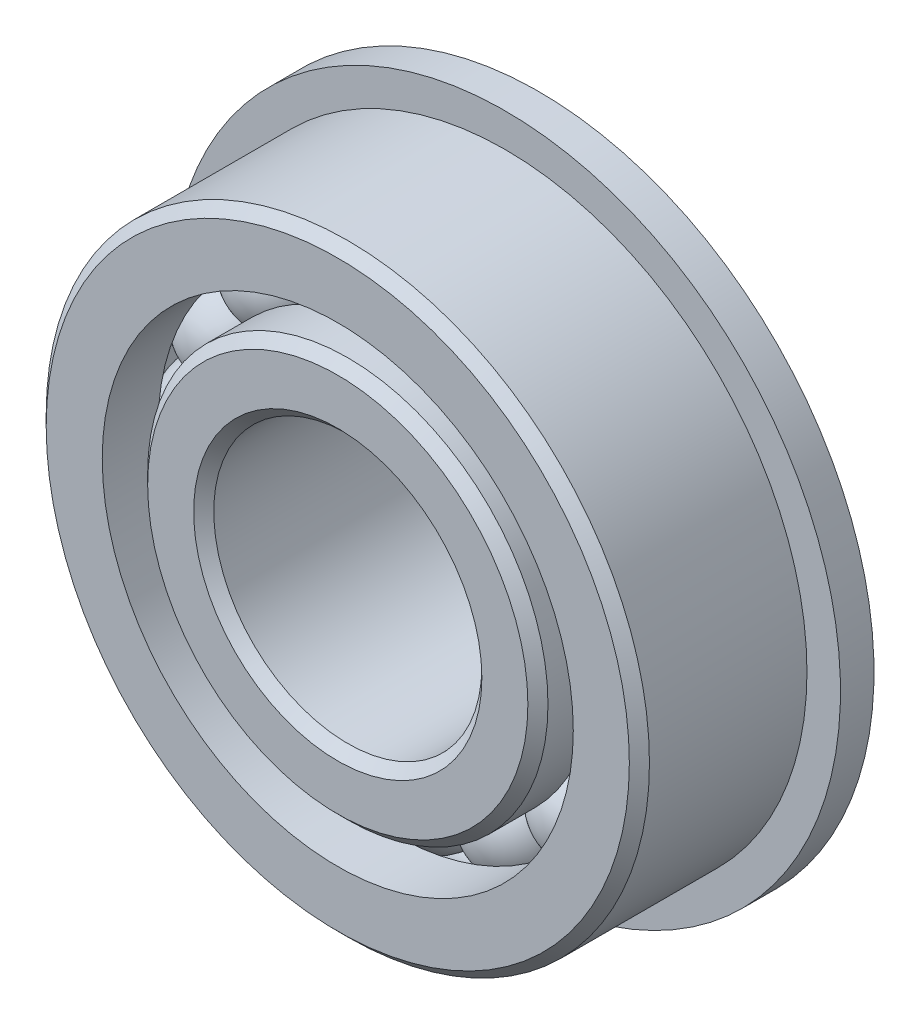
ISO-10303-21;
HEADER;
FILE_DESCRIPTION(('STEP AP214'),'2;1');
FILE_NAME('part.step','',(''),(''),'','','');
FILE_SCHEMA(('AUTOMOTIVE_DESIGN { 1 0 10303 214 1 1 1 1 }'));
ENDSEC;
DATA;
#1=APPLICATION_CONTEXT('core data for automotive mechanical design processes');
#2=APPLICATION_PROTOCOL_DEFINITION('international standard','automotive_design',2000,#1);
#3=PRODUCT_CONTEXT('',#1,'mechanical');
#4=PRODUCT('Part','Part','',(#3));
#5=PRODUCT_RELATED_PRODUCT_CATEGORY('part','',(#4));
#6=PRODUCT_DEFINITION_FORMATION('','',#4);
#7=PRODUCT_DEFINITION_CONTEXT('part definition',#1,'design');
#8=PRODUCT_DEFINITION('design','',#6,#7);
#9=PRODUCT_DEFINITION_SHAPE('','',#8);
#10=(LENGTH_UNIT() NAMED_UNIT(*) SI_UNIT(.MILLI.,.METRE.));
#11=(NAMED_UNIT(*) PLANE_ANGLE_UNIT() SI_UNIT($,.RADIAN.));
#12=(NAMED_UNIT(*) SI_UNIT($,.STERADIAN.) SOLID_ANGLE_UNIT());
#13=UNCERTAINTY_MEASURE_WITH_UNIT(LENGTH_MEASURE(1.E-05),#10,'distance_accuracy_value','');
#14=(GEOMETRIC_REPRESENTATION_CONTEXT(3) GLOBAL_UNCERTAINTY_ASSIGNED_CONTEXT((#13)) GLOBAL_UNIT_ASSIGNED_CONTEXT((#10,
#11,#12)) REPRESENTATION_CONTEXT('',''));
#15=CARTESIAN_POINT('',(0.,0.,0.));
#16=DIRECTION('',(0.,0.,1.));
#17=DIRECTION('',(1.,0.,0.));
#18=AXIS2_PLACEMENT_3D('',#15,#16,#17);
#19=CARTESIAN_POINT('',(-3.94881466771714,9.53328192610089,0.));
#20=DIRECTION('',(0.,0.,1.));
#21=DIRECTION('',(-0.382683432365077,0.923879532511292,0.));
#22=AXIS2_PLACEMENT_3D('',#19,#20,#21);
#23=SPHERICAL_SURFACE('',#22,2.27628073054021);
#24=CARTESIAN_POINT('',(-3.94881466771714,9.53328192610089,2.27628073054021));
#25=VERTEX_POINT('',#24);
#26=VERTEX_LOOP('',#25);
#27=FACE_BOUND('',#26,.T.);
#28=ADVANCED_FACE('F37',(#27),#23,.T.);
#29=CLOSED_SHELL('',(#28));
#30=MANIFOLD_SOLID_BREP('B2',#29);
#31=CARTESIAN_POINT('',(-7.2964580983686,7.29645809836878,0.));
#32=DIRECTION('',(0.,0.,1.));
#33=DIRECTION('',(-0.707106781186539,0.707106781186556,0.));
#34=AXIS2_PLACEMENT_3D('',#31,#32,#33);
#35=SPHERICAL_SURFACE('',#34,2.27628073054021);
#36=CARTESIAN_POINT('',(-7.2964580983686,7.29645809836878,2.27628073054021));
#37=VERTEX_POINT('',#36);
#38=VERTEX_LOOP('',#37);
#39=FACE_BOUND('',#38,.T.);
#40=ADVANCED_FACE('F57',(#39),#35,.T.);
#41=CLOSED_SHELL('',(#40));
#42=MANIFOLD_SOLID_BREP('B6',#41);
#43=CARTESIAN_POINT('',(-9.5332819261008,3.94881466771737,0.));
#44=DIRECTION('',(0.,0.,1.));
#45=DIRECTION('',(-0.923879532511283,0.3826834323651,0.));
#46=AXIS2_PLACEMENT_3D('',#43,#44,#45);
#47=SPHERICAL_SURFACE('',#46,2.27628073054021);
#48=CARTESIAN_POINT('',(-9.5332819261008,3.94881466771737,2.27628073054021));
#49=VERTEX_POINT('',#48);
#50=VERTEX_LOOP('',#49);
#51=FACE_BOUND('',#50,.T.);
#52=ADVANCED_FACE('F77',(#51),#47,.T.);
#53=CLOSED_SHELL('',(#52));
#54=MANIFOLD_SOLID_BREP('B33',#53);
#55=CARTESIAN_POINT('',(-10.31875,1.08083169195563E-13,0.));
#56=DIRECTION('',(0.,0.,1.));
#57=DIRECTION('',(-1.,0.,0.));
#58=AXIS2_PLACEMENT_3D('',#55,#56,#57);
#59=SPHERICAL_SURFACE('',#58,2.27628073054021);
#60=CARTESIAN_POINT('',(-10.31875,1.08083169195563E-13,2.27628073054021));
#61=VERTEX_POINT('',#60);
#62=VERTEX_LOOP('',#61);
#63=FACE_BOUND('',#62,.T.);
#64=ADVANCED_FACE('F97',(#63),#59,.T.);
#65=CLOSED_SHELL('',(#64));
#66=MANIFOLD_SOLID_BREP('B53',#65);
#67=CARTESIAN_POINT('',(-9.53328192610088,-3.94881466771717,0.));
#68=DIRECTION('',(0.,0.,1.));
#69=DIRECTION('',(-0.923879532511291,-0.382683432365081,0.));
#70=AXIS2_PLACEMENT_3D('',#67,#68,#69);
#71=SPHERICAL_SURFACE('',#70,2.27628073054021);
#72=CARTESIAN_POINT('',(-9.53328192610088,-3.94881466771717,2.27628073054021));
#73=VERTEX_POINT('',#72);
#74=VERTEX_LOOP('',#73);
#75=FACE_BOUND('',#74,.T.);
#76=ADVANCED_FACE('F117',(#75),#71,.T.);
#77=CLOSED_SHELL('',(#76));
#78=MANIFOLD_SOLID_BREP('B73',#77);
#79=CARTESIAN_POINT('',(-7.29645809836875,-7.29645809836862,0.));
#80=DIRECTION('',(0.,0.,1.));
#81=DIRECTION('',(-0.707106781186554,-0.707106781186541,0.));
#82=AXIS2_PLACEMENT_3D('',#79,#80,#81);
#83=SPHERICAL_SURFACE('',#82,2.27628073054021);
#84=CARTESIAN_POINT('',(-7.29645809836875,-7.29645809836862,2.27628073054021));
#85=VERTEX_POINT('',#84);
#86=VERTEX_LOOP('',#85);
#87=FACE_BOUND('',#86,.T.);
#88=ADVANCED_FACE('F137',(#87),#83,.T.);
#89=CLOSED_SHELL('',(#88));
#90=MANIFOLD_SOLID_BREP('B93',#89);
#91=CARTESIAN_POINT('',(-3.94881466771735,-9.53328192610081,0.));
#92=DIRECTION('',(0.,0.,1.));
#93=DIRECTION('',(-0.382683432365097,-0.923879532511284,0.));
#94=AXIS2_PLACEMENT_3D('',#91,#92,#93);
#95=SPHERICAL_SURFACE('',#94,2.27628073054021);
#96=CARTESIAN_POINT('',(-3.94881466771735,-9.53328192610081,2.27628073054021));
#97=VERTEX_POINT('',#96);
#98=VERTEX_LOOP('',#97);
#99=FACE_BOUND('',#98,.T.);
#100=ADVANCED_FACE('F157',(#99),#95,.T.);
#101=CLOSED_SHELL('',(#100));
#102=MANIFOLD_SOLID_BREP('B113',#101);
#103=CARTESIAN_POINT('',(0.,-10.31875,0.));
#104=DIRECTION('',(0.,0.,1.));
#105=DIRECTION('',(0.,-1.,0.));
#106=AXIS2_PLACEMENT_3D('',#103,#104,#105);
#107=SPHERICAL_SURFACE('',#106,2.27628073054021);
#108=CARTESIAN_POINT('',(0.,-10.31875,2.27628073054021));
#109=VERTEX_POINT('',#108);
#110=VERTEX_LOOP('',#109);
#111=FACE_BOUND('',#110,.T.);
#112=ADVANCED_FACE('F177',(#111),#107,.T.);
#113=CLOSED_SHELL('',(#112));
#114=MANIFOLD_SOLID_BREP('B133',#113);
#115=CARTESIAN_POINT('',(3.94881466771721,-9.53328192610086,0.));
#116=DIRECTION('',(0.,0.,1.));
#117=DIRECTION('',(0.382683432365084,-0.923879532511289,0.));
#118=AXIS2_PLACEMENT_3D('',#115,#116,#117);
#119=SPHERICAL_SURFACE('',#118,2.27628073054021);
#120=CARTESIAN_POINT('',(3.94881466771721,-9.53328192610086,2.27628073054021));
#121=VERTEX_POINT('',#120);
#122=VERTEX_LOOP('',#121);
#123=FACE_BOUND('',#122,.T.);
#124=ADVANCED_FACE('F197',(#123),#119,.T.);
#125=CLOSED_SHELL('',(#124));
#126=MANIFOLD_SOLID_BREP('B153',#125);
#127=CARTESIAN_POINT('',(7.29645809836865,-7.29645809836873,0.));
#128=DIRECTION('',(0.,0.,1.));
#129=DIRECTION('',(0.707106781186544,-0.707106781186551,0.));
#130=AXIS2_PLACEMENT_3D('',#127,#128,#129);
#131=SPHERICAL_SURFACE('',#130,2.27628073054021);
#132=CARTESIAN_POINT('',(7.29645809836865,-7.29645809836873,2.27628073054021));
#133=VERTEX_POINT('',#132);
#134=VERTEX_LOOP('',#133);
#135=FACE_BOUND('',#134,.T.);
#136=ADVANCED_FACE('F217',(#135),#131,.T.);
#137=CLOSED_SHELL('',(#136));
#138=MANIFOLD_SOLID_BREP('B173',#137);
#139=CARTESIAN_POINT('',(9.53328192610082,-3.94881466771731,0.));
#140=DIRECTION('',(0.,0.,1.));
#141=DIRECTION('',(0.923879532511285,-0.382683432365094,0.));
#142=AXIS2_PLACEMENT_3D('',#139,#140,#141);
#143=SPHERICAL_SURFACE('',#142,2.27628073054021);
#144=CARTESIAN_POINT('',(9.53328192610082,-3.94881466771731,2.27628073054021));
#145=VERTEX_POINT('',#144);
#146=VERTEX_LOOP('',#145);
#147=FACE_BOUND('',#146,.T.);
#148=ADVANCED_FACE('F237',(#147),#143,.T.);
#149=CLOSED_SHELL('',(#148));
#150=MANIFOLD_SOLID_BREP('B193',#149);
#151=CARTESIAN_POINT('',(10.31875,0.,0.));
#152=DIRECTION('',(0.,0.,1.));
#153=DIRECTION('',(1.,0.,0.));
#154=AXIS2_PLACEMENT_3D('',#151,#152,#153);
#155=SPHERICAL_SURFACE('',#154,2.27628073054021);
#156=CARTESIAN_POINT('',(10.31875,0.,2.27628073054021));
#157=VERTEX_POINT('',#156);
#158=VERTEX_LOOP('',#157);
#159=FACE_BOUND('',#158,.T.);
#160=ADVANCED_FACE('F257',(#159),#155,.T.);
#161=CLOSED_SHELL('',(#160));
#162=MANIFOLD_SOLID_BREP('B213',#161);
#163=CARTESIAN_POINT('',(9.53328192610085,3.94881466771724,0.));
#164=DIRECTION('',(0.,0.,1.));
#165=DIRECTION('',(0.923879532511288,0.382683432365087,0.));
#166=AXIS2_PLACEMENT_3D('',#163,#164,#165);
#167=SPHERICAL_SURFACE('',#166,2.27628073054021);
#168=CARTESIAN_POINT('',(9.53328192610085,3.94881466771724,2.27628073054021));
#169=VERTEX_POINT('',#168);
#170=VERTEX_LOOP('',#169);
#171=FACE_BOUND('',#170,.T.);
#172=ADVANCED_FACE('F277',(#171),#167,.T.);
#173=CLOSED_SHELL('',(#172));
#174=MANIFOLD_SOLID_BREP('B233',#173);
#175=CARTESIAN_POINT('',(7.2964580983687,7.29645809836867,0.));
#176=DIRECTION('',(0.,0.,1.));
#177=DIRECTION('',(0.707106781186549,0.707106781186546,0.));
#178=AXIS2_PLACEMENT_3D('',#175,#176,#177);
#179=SPHERICAL_SURFACE('',#178,2.27628073054021);
#180=CARTESIAN_POINT('',(7.2964580983687,7.29645809836867,2.27628073054021));
#181=VERTEX_POINT('',#180);
#182=VERTEX_LOOP('',#181);
#183=FACE_BOUND('',#182,.T.);
#184=ADVANCED_FACE('F297',(#183),#179,.T.);
#185=CLOSED_SHELL('',(#184));
#186=MANIFOLD_SOLID_BREP('B253',#185);
#187=CARTESIAN_POINT('',(3.94881466771728,9.53328192610084,0.));
#188=DIRECTION('',(0.,0.,1.));
#189=DIRECTION('',(0.382683432365091,0.923879532511287,0.));
#190=AXIS2_PLACEMENT_3D('',#187,#188,#189);
#191=SPHERICAL_SURFACE('',#190,2.27628073054021);
#192=CARTESIAN_POINT('',(3.94881466771728,9.53328192610084,2.27628073054021));
#193=VERTEX_POINT('',#192);
#194=VERTEX_LOOP('',#193);
#195=FACE_BOUND('',#194,.T.);
#196=ADVANCED_FACE('F317',(#195),#191,.T.);
#197=CLOSED_SHELL('',(#196));
#198=MANIFOLD_SOLID_BREP('B273',#197);
#199=CARTESIAN_POINT('',(0.,10.31875,0.));
#200=DIRECTION('',(0.,0.,1.));
#201=DIRECTION('',(0.,1.,0.));
#202=AXIS2_PLACEMENT_3D('',#199,#200,#201);
#203=SPHERICAL_SURFACE('',#202,2.27628073054021);
#204=CARTESIAN_POINT('',(0.,10.31875,2.27628073054021));
#205=VERTEX_POINT('',#204);
#206=VERTEX_LOOP('',#205);
#207=FACE_BOUND('',#206,.T.);
#208=ADVANCED_FACE('F339',(#207),#203,.T.);
#209=CLOSED_SHELL('',(#208));
#210=MANIFOLD_SOLID_BREP('B293',#209);
#211=CARTESIAN_POINT('',(0.,0.,4.28625));
#212=DIRECTION('',(0.,0.,-1.));
#213=DIRECTION('',(-1.,0.,0.));
#214=AXIS2_PLACEMENT_3D('',#211,#212,#213);
#215=CONICAL_SURFACE('',#214,9.48138736263737,0.785398163397445);
#216=CARTESIAN_POINT('',(0.,0.,4.7625));
#217=DIRECTION('',(0.,0.,1.));
#218=DIRECTION('',(1.,0.,0.));
#219=AXIS2_PLACEMENT_3D('',#216,#217,#218);
#220=CIRCLE('',#219,9.00513736263737);
#221=CARTESIAN_POINT('',(9.00513736263737,0.,4.7625));
#222=VERTEX_POINT('',#221);
#223=EDGE_CURVE('E392',#222,#222,#220,.T.);
#224=ORIENTED_EDGE('',*,*,#223,.F.);
#225=EDGE_LOOP('',(#224));
#226=FACE_BOUND('',#225,.T.);
#227=CARTESIAN_POINT('',(0.,0.,4.28625));
#228=DIRECTION('',(0.,0.,1.));
#229=DIRECTION('',(1.,0.,0.));
#230=AXIS2_PLACEMENT_3D('',#227,#228,#229);
#231=CIRCLE('',#230,9.48138736263737);
#232=CARTESIAN_POINT('',(9.48138736263737,0.,4.28625));
#233=VERTEX_POINT('',#232);
#234=EDGE_CURVE('E338',#233,#233,#231,.T.);
#235=ORIENTED_EDGE('',*,*,#234,.T.);
#236=EDGE_LOOP('',(#235));
#237=FACE_BOUND('',#236,.T.);
#238=ADVANCED_FACE('F358',(#226,#237),#215,.T.);
#239=CARTESIAN_POINT('',(0.,0.,4.7625));
#240=DIRECTION('',(0.,0.,1.));
#241=DIRECTION('',(1.,0.,0.));
#242=AXIS2_PLACEMENT_3D('',#239,#240,#241);
#243=CYLINDRICAL_SURFACE('',#242,9.48138736263737);
#244=ORIENTED_EDGE('',*,*,#234,.F.);
#245=EDGE_LOOP('',(#244));
#246=FACE_BOUND('',#245,.T.);
#247=CARTESIAN_POINT('',(0.,0.,2.11666666666666));
#248=DIRECTION('',(0.,0.,1.));
#249=DIRECTION('',(1.,0.,0.));
#250=AXIS2_PLACEMENT_3D('',#247,#248,#249);
#251=CIRCLE('',#250,9.48138736263737);
#252=CARTESIAN_POINT('',(9.48138736263737,0.,2.11666666666666));
#253=VERTEX_POINT('',#252);
#254=EDGE_CURVE('E364',#253,#253,#251,.T.);
#255=ORIENTED_EDGE('',*,*,#254,.T.);
#256=EDGE_LOOP('',(#255));
#257=FACE_BOUND('',#256,.T.);
#258=ADVANCED_FACE('F399',(#246,#257),#243,.T.);
#259=CARTESIAN_POINT('',(0.,0.,0.));
#260=DIRECTION('',(0.,0.,1.));
#261=DIRECTION('',(1.,0.,0.));
#262=AXIS2_PLACEMENT_3D('',#259,#260,#261);
#263=TOROIDAL_SURFACE('',#262,10.31875,2.27628073054021);
#264=ORIENTED_EDGE('',*,*,#254,.F.);
#265=EDGE_LOOP('',(#264));
#266=FACE_BOUND('',#265,.T.);
#267=CARTESIAN_POINT('',(0.,0.,-2.11666666666667));
#268=DIRECTION('',(0.,0.,1.));
#269=DIRECTION('',(1.,0.,0.));
#270=AXIS2_PLACEMENT_3D('',#267,#268,#269);
#271=CIRCLE('',#270,9.48138736263737);
#272=CARTESIAN_POINT('',(9.48138736263737,0.,-2.11666666666667));
#273=VERTEX_POINT('',#272);
#274=EDGE_CURVE('E368',#273,#273,#271,.T.);
#275=ORIENTED_EDGE('',*,*,#274,.T.);
#276=EDGE_LOOP('',(#275));
#277=FACE_BOUND('',#276,.T.);
#278=ADVANCED_FACE('F403',(#266,#277),#263,.F.);
#279=CARTESIAN_POINT('',(0.,0.,4.7625));
#280=DIRECTION('',(0.,0.,1.));
#281=DIRECTION('',(1.,0.,0.));
#282=AXIS2_PLACEMENT_3D('',#279,#280,#281);
#283=CYLINDRICAL_SURFACE('',#282,9.48138736263737);
#284=ORIENTED_EDGE('',*,*,#274,.F.);
#285=EDGE_LOOP('',(#284));
#286=FACE_BOUND('',#285,.T.);
#287=CARTESIAN_POINT('',(0.,0.,-5.87374999999999));
#288=DIRECTION('',(0.,0.,1.));
#289=DIRECTION('',(1.,0.,0.));
#290=AXIS2_PLACEMENT_3D('',#287,#288,#289);
#291=CIRCLE('',#290,9.48138736263737);
#292=CARTESIAN_POINT('',(9.48138736263737,0.,-5.87374999999999));
#293=VERTEX_POINT('',#292);
#294=EDGE_CURVE('E372',#293,#293,#291,.T.);
#295=ORIENTED_EDGE('',*,*,#294,.T.);
#296=EDGE_LOOP('',(#295));
#297=FACE_BOUND('',#296,.T.);
#298=ADVANCED_FACE('F408',(#286,#297),#283,.T.);
#299=CARTESIAN_POINT('',(0.,0.,-6.35));
#300=DIRECTION('',(0.,0.,1.));
#301=DIRECTION('',(1.,0.,0.));
#302=AXIS2_PLACEMENT_3D('',#299,#300,#301);
#303=CONICAL_SURFACE('',#302,9.00513736263737,0.785398163397443);
#304=ORIENTED_EDGE('',*,*,#294,.F.);
#305=EDGE_LOOP('',(#304));
#306=FACE_BOUND('',#305,.T.);
#307=CARTESIAN_POINT('',(0.,0.,-6.35));
#308=DIRECTION('',(0.,0.,1.));
#309=DIRECTION('',(1.,0.,0.));
#310=AXIS2_PLACEMENT_3D('',#307,#308,#309);
#311=CIRCLE('',#310,9.00513736263737);
#312=CARTESIAN_POINT('',(9.00513736263737,0.,-6.35));
#313=VERTEX_POINT('',#312);
#314=EDGE_CURVE('E377',#313,#313,#311,.T.);
#315=ORIENTED_EDGE('',*,*,#314,.T.);
#316=EDGE_LOOP('',(#315));
#317=FACE_BOUND('',#316,.T.);
#318=ADVANCED_FACE('F414',(#306,#317),#303,.T.);
#319=CARTESIAN_POINT('',(0.,9.00513736263737,-6.34999999999999));
#320=DIRECTION('',(0.,0.,1.));
#321=DIRECTION('',(1.,0.,0.));
#322=AXIS2_PLACEMENT_3D('',#319,#320,#321);
#323=PLANE('',#322);
#324=ORIENTED_EDGE('',*,*,#314,.F.);
#325=EDGE_LOOP('',(#324));
#326=FACE_BOUND('',#325,.T.);
#327=CARTESIAN_POINT('',(0.,0.,-6.34999999999999));
#328=DIRECTION('',(0.,0.,1.));
#329=DIRECTION('',(1.,0.,0.));
#330=AXIS2_PLACEMENT_3D('',#327,#328,#329);
#331=CIRCLE('',#330,6.82625);
#332=CARTESIAN_POINT('',(6.82625,0.,-6.34999999999999));
#333=VERTEX_POINT('',#332);
#334=EDGE_CURVE('E380',#333,#333,#331,.T.);
#335=ORIENTED_EDGE('',*,*,#334,.T.);
#336=EDGE_LOOP('',(#335));
#337=FACE_BOUND('',#336,.T.);
#338=ADVANCED_FACE('F418',(#326,#337),#323,.F.);
#339=CARTESIAN_POINT('',(0.,0.,-5.87374999999999));
#340=DIRECTION('',(0.,0.,-1.));
#341=DIRECTION('',(-1.,0.,0.));
#342=AXIS2_PLACEMENT_3D('',#339,#340,#341);
#343=CONICAL_SURFACE('',#342,6.35,0.785398163397447);
#344=ORIENTED_EDGE('',*,*,#334,.F.);
#345=EDGE_LOOP('',(#344));
#346=FACE_BOUND('',#345,.T.);
#347=CARTESIAN_POINT('',(0.,0.,-5.87374999999999));
#348=DIRECTION('',(0.,0.,1.));
#349=DIRECTION('',(1.,0.,0.));
#350=AXIS2_PLACEMENT_3D('',#347,#348,#349);
#351=CIRCLE('',#350,6.35);
#352=CARTESIAN_POINT('',(6.35,0.,-5.87374999999999));
#353=VERTEX_POINT('',#352);
#354=EDGE_CURVE('E383',#353,#353,#351,.T.);
#355=ORIENTED_EDGE('',*,*,#354,.T.);
#356=EDGE_LOOP('',(#355));
#357=FACE_BOUND('',#356,.T.);
#358=ADVANCED_FACE('F422',(#346,#357),#343,.F.);
#359=CARTESIAN_POINT('',(0.,0.,4.7625));
#360=DIRECTION('',(0.,0.,1.));
#361=DIRECTION('',(1.,0.,0.));
#362=AXIS2_PLACEMENT_3D('',#359,#360,#361);
#363=CYLINDRICAL_SURFACE('',#362,6.35);
#364=ORIENTED_EDGE('',*,*,#354,.F.);
#365=EDGE_LOOP('',(#364));
#366=FACE_BOUND('',#365,.T.);
#367=CARTESIAN_POINT('',(0.,0.,4.28625000000001));
#368=DIRECTION('',(0.,0.,1.));
#369=DIRECTION('',(1.,0.,0.));
#370=AXIS2_PLACEMENT_3D('',#367,#368,#369);
#371=CIRCLE('',#370,6.35);
#372=CARTESIAN_POINT('',(6.35,0.,4.28625000000001));
#373=VERTEX_POINT('',#372);
#374=EDGE_CURVE('E386',#373,#373,#371,.T.);
#375=ORIENTED_EDGE('',*,*,#374,.T.);
#376=EDGE_LOOP('',(#375));
#377=FACE_BOUND('',#376,.T.);
#378=ADVANCED_FACE('F426',(#366,#377),#363,.F.);
#379=CARTESIAN_POINT('',(0.,0.,4.7625));
#380=DIRECTION('',(0.,0.,1.));
#381=DIRECTION('',(1.,0.,0.));
#382=AXIS2_PLACEMENT_3D('',#379,#380,#381);
#383=CONICAL_SURFACE('',#382,6.82625,0.785398163397451);
#384=ORIENTED_EDGE('',*,*,#374,.F.);
#385=EDGE_LOOP('',(#384));
#386=FACE_BOUND('',#385,.T.);
#387=CARTESIAN_POINT('',(0.,0.,4.7625));
#388=DIRECTION('',(0.,0.,1.));
#389=DIRECTION('',(1.,0.,0.));
#390=AXIS2_PLACEMENT_3D('',#387,#388,#389);
#391=CIRCLE('',#390,6.82625);
#392=CARTESIAN_POINT('',(6.82625,0.,4.7625));
#393=VERTEX_POINT('',#392);
#394=EDGE_CURVE('E389',#393,#393,#391,.T.);
#395=ORIENTED_EDGE('',*,*,#394,.T.);
#396=EDGE_LOOP('',(#395));
#397=FACE_BOUND('',#396,.T.);
#398=ADVANCED_FACE('F430',(#386,#397),#383,.F.);
#399=CARTESIAN_POINT('',(0.,6.82625,4.7625));
#400=DIRECTION('',(0.,0.,-1.));
#401=DIRECTION('',(-1.,0.,0.));
#402=AXIS2_PLACEMENT_3D('',#399,#400,#401);
#403=PLANE('',#402);
#404=ORIENTED_EDGE('',*,*,#394,.F.);
#405=EDGE_LOOP('',(#404));
#406=FACE_BOUND('',#405,.T.);
#407=ORIENTED_EDGE('',*,*,#223,.T.);
#408=EDGE_LOOP('',(#407));
#409=FACE_BOUND('',#408,.T.);
#410=ADVANCED_FACE('F396',(#406,#409),#403,.F.);
#411=CLOSED_SHELL('',(#238,#258,#278,#298,#318,#338,#358,#378,#398,#410));
#412=MANIFOLD_SOLID_BREP('B313',#411);
#413=CARTESIAN_POINT('',(0.,0.,4.28625));
#414=DIRECTION('',(0.,0.,-1.));
#415=DIRECTION('',(-1.,0.,0.));
#416=AXIS2_PLACEMENT_3D('',#413,#414,#415);
#417=CONICAL_SURFACE('',#416,14.2875,0.785398163397445);
#418=CARTESIAN_POINT('',(0.,0.,4.7625));
#419=DIRECTION('',(0.,0.,1.));
#420=DIRECTION('',(1.,0.,0.));
#421=AXIS2_PLACEMENT_3D('',#418,#419,#420);
#422=CIRCLE('',#421,13.81125);
#423=CARTESIAN_POINT('',(13.81125,0.,4.7625));
#424=VERTEX_POINT('',#423);
#425=EDGE_CURVE('E531',#424,#424,#422,.T.);
#426=ORIENTED_EDGE('',*,*,#425,.F.);
#427=EDGE_LOOP('',(#426));
#428=FACE_BOUND('',#427,.T.);
#429=CARTESIAN_POINT('',(0.,0.,4.28625));
#430=DIRECTION('',(0.,0.,1.));
#431=DIRECTION('',(1.,0.,0.));
#432=AXIS2_PLACEMENT_3D('',#429,#430,#431);
#433=CIRCLE('',#432,14.2875);
#434=CARTESIAN_POINT('',(14.2875,0.,4.28625));
#435=VERTEX_POINT('',#434);
#436=EDGE_CURVE('E357',#435,#435,#433,.T.);
#437=ORIENTED_EDGE('',*,*,#436,.T.);
#438=EDGE_LOOP('',(#437));
#439=FACE_BOUND('',#438,.T.);
#440=ADVANCED_FACE('F509',(#428,#439),#417,.T.);
#441=CARTESIAN_POINT('',(0.,0.,4.7625));
#442=DIRECTION('',(0.,0.,1.));
#443=DIRECTION('',(1.,0.,0.));
#444=AXIS2_PLACEMENT_3D('',#441,#442,#443);
#445=CYLINDRICAL_SURFACE('',#444,14.2875);
#446=CARTESIAN_POINT('',(0.,0.,-3.175));
#447=DIRECTION('',(0.,0.,1.));
#448=DIRECTION('',(1.,0.,0.));
#449=AXIS2_PLACEMENT_3D('',#446,#447,#448);
#450=CIRCLE('',#449,14.2875);
#451=CARTESIAN_POINT('',(14.2875,0.,-3.175));
#452=VERTEX_POINT('',#451);
#453=EDGE_CURVE('E534',#452,#452,#450,.T.);
#454=ORIENTED_EDGE('',*,*,#453,.T.);
#455=EDGE_LOOP('',(#454));
#456=FACE_BOUND('',#455,.T.);
#457=ORIENTED_EDGE('',*,*,#436,.F.);
#458=EDGE_LOOP('',(#457));
#459=FACE_BOUND('',#458,.T.);
#460=ADVANCED_FACE('F554',(#456,#459),#445,.T.);
#461=CARTESIAN_POINT('',(0.,13.81125,-4.7625));
#462=DIRECTION('',(0.,0.,1.));
#463=DIRECTION('',(1.,0.,0.));
#464=AXIS2_PLACEMENT_3D('',#461,#462,#463);
#465=PLANE('',#464);
#466=CARTESIAN_POINT('',(0.,0.,-4.7625));
#467=DIRECTION('',(0.,0.,1.));
#468=DIRECTION('',(1.,0.,0.));
#469=AXIS2_PLACEMENT_3D('',#466,#467,#468);
#470=CIRCLE('',#469,11.1561126373626);
#471=CARTESIAN_POINT('',(11.1561126373626,0.,-4.7625));
#472=VERTEX_POINT('',#471);
#473=EDGE_CURVE('E515',#472,#472,#470,.T.);
#474=ORIENTED_EDGE('',*,*,#473,.T.);
#475=EDGE_LOOP('',(#474));
#476=FACE_BOUND('',#475,.T.);
#477=CARTESIAN_POINT('',(0.,0.,-4.7625));
#478=DIRECTION('',(0.,0.,-1.));
#479=DIRECTION('',(-1.,0.,0.));
#480=AXIS2_PLACEMENT_3D('',#477,#478,#479);
#481=CIRCLE('',#480,15.875);
#482=CARTESIAN_POINT('',(-15.875,0.,-4.7625));
#483=VERTEX_POINT('',#482);
#484=EDGE_CURVE('E537',#483,#483,#481,.T.);
#485=ORIENTED_EDGE('',*,*,#484,.T.);
#486=EDGE_LOOP('',(#485));
#487=FACE_BOUND('',#486,.T.);
#488=ADVANCED_FACE('F557',(#476,#487),#465,.F.);
#489=CARTESIAN_POINT('',(0.,0.,4.7625));
#490=DIRECTION('',(0.,0.,1.));
#491=DIRECTION('',(1.,0.,0.));
#492=AXIS2_PLACEMENT_3D('',#489,#490,#491);
#493=CYLINDRICAL_SURFACE('',#492,11.1561126373626);
#494=CARTESIAN_POINT('',(0.,0.,-2.11666666666667));
#495=DIRECTION('',(0.,0.,1.));
#496=DIRECTION('',(1.,0.,0.));
#497=AXIS2_PLACEMENT_3D('',#494,#495,#496);
#498=CIRCLE('',#497,11.1561126373626);
#499=CARTESIAN_POINT('',(11.1561126373626,0.,-2.11666666666667));
#500=VERTEX_POINT('',#499);
#501=EDGE_CURVE('E519',#500,#500,#498,.T.);
#502=ORIENTED_EDGE('',*,*,#501,.T.);
#503=EDGE_LOOP('',(#502));
#504=FACE_BOUND('',#503,.T.);
#505=ORIENTED_EDGE('',*,*,#473,.F.);
#506=EDGE_LOOP('',(#505));
#507=FACE_BOUND('',#506,.T.);
#508=ADVANCED_FACE('F562',(#504,#507),#493,.F.);
#509=CARTESIAN_POINT('',(0.,0.,0.));
#510=DIRECTION('',(0.,0.,1.));
#511=DIRECTION('',(1.,0.,0.));
#512=AXIS2_PLACEMENT_3D('',#509,#510,#511);
#513=TOROIDAL_SURFACE('',#512,10.31875,2.27628073054021);
#514=ORIENTED_EDGE('',*,*,#501,.F.);
#515=EDGE_LOOP('',(#514));
#516=FACE_BOUND('',#515,.T.);
#517=CARTESIAN_POINT('',(0.,0.,2.11666666666667));
#518=DIRECTION('',(0.,0.,1.));
#519=DIRECTION('',(1.,0.,0.));
#520=AXIS2_PLACEMENT_3D('',#517,#518,#519);
#521=CIRCLE('',#520,11.1561126373626);
#522=CARTESIAN_POINT('',(11.1561126373626,0.,2.11666666666667));
#523=VERTEX_POINT('',#522);
#524=EDGE_CURVE('E523',#523,#523,#521,.T.);
#525=ORIENTED_EDGE('',*,*,#524,.T.);
#526=EDGE_LOOP('',(#525));
#527=FACE_BOUND('',#526,.T.);
#528=ADVANCED_FACE('F568',(#516,#527),#513,.F.);
#529=CARTESIAN_POINT('',(0.,0.,4.7625));
#530=DIRECTION('',(0.,0.,1.));
#531=DIRECTION('',(1.,0.,0.));
#532=AXIS2_PLACEMENT_3D('',#529,#530,#531);
#533=CYLINDRICAL_SURFACE('',#532,11.1561126373626);
#534=ORIENTED_EDGE('',*,*,#524,.F.);
#535=EDGE_LOOP('',(#534));
#536=FACE_BOUND('',#535,.T.);
#537=CARTESIAN_POINT('',(0.,0.,4.7625));
#538=DIRECTION('',(0.,0.,1.));
#539=DIRECTION('',(1.,0.,0.));
#540=AXIS2_PLACEMENT_3D('',#537,#538,#539);
#541=CIRCLE('',#540,11.1561126373626);
#542=CARTESIAN_POINT('',(11.1561126373626,0.,4.7625));
#543=VERTEX_POINT('',#542);
#544=EDGE_CURVE('E528',#543,#543,#541,.T.);
#545=ORIENTED_EDGE('',*,*,#544,.T.);
#546=EDGE_LOOP('',(#545));
#547=FACE_BOUND('',#546,.T.);
#548=ADVANCED_FACE('F572',(#536,#547),#533,.F.);
#549=CARTESIAN_POINT('',(0.,13.81125,4.7625));
#550=DIRECTION('',(0.,0.,-1.));
#551=DIRECTION('',(-1.,0.,0.));
#552=AXIS2_PLACEMENT_3D('',#549,#550,#551);
#553=PLANE('',#552);
#554=ORIENTED_EDGE('',*,*,#544,.F.);
#555=EDGE_LOOP('',(#554));
#556=FACE_BOUND('',#555,.T.);
#557=ORIENTED_EDGE('',*,*,#425,.T.);
#558=EDGE_LOOP('',(#557));
#559=FACE_BOUND('',#558,.T.);
#560=ADVANCED_FACE('F550',(#556,#559),#553,.F.);
#561=CARTESIAN_POINT('',(0.,11.1561126373626,-3.175));
#562=DIRECTION('',(0.,0.,1.));
#563=DIRECTION('',(1.,0.,0.));
#564=AXIS2_PLACEMENT_3D('',#561,#562,#563);
#565=PLANE('',#564);
#566=CARTESIAN_POINT('',(0.,0.,-3.175));
#567=DIRECTION('',(0.,0.,-1.));
#568=DIRECTION('',(-1.,0.,0.));
#569=AXIS2_PLACEMENT_3D('',#566,#567,#568);
#570=CIRCLE('',#569,15.875);
#571=CARTESIAN_POINT('',(-15.875,0.,-3.175));
#572=VERTEX_POINT('',#571);
#573=EDGE_CURVE('E540',#572,#572,#570,.T.);
#574=ORIENTED_EDGE('',*,*,#573,.F.);
#575=EDGE_LOOP('',(#574));
#576=FACE_BOUND('',#575,.T.);
#577=ORIENTED_EDGE('',*,*,#453,.F.);
#578=EDGE_LOOP('',(#577));
#579=FACE_BOUND('',#578,.T.);
#580=ADVANCED_FACE('F547',(#576,#579),#565,.T.);
#581=CARTESIAN_POINT('',(0.,0.,-4.7625));
#582=DIRECTION('',(0.,0.,-1.));
#583=DIRECTION('',(-1.,0.,0.));
#584=AXIS2_PLACEMENT_3D('',#581,#582,#583);
#585=CYLINDRICAL_SURFACE('',#584,15.875);
#586=ORIENTED_EDGE('',*,*,#573,.T.);
#587=EDGE_LOOP('',(#586));
#588=FACE_BOUND('',#587,.T.);
#589=ORIENTED_EDGE('',*,*,#484,.F.);
#590=EDGE_LOOP('',(#589));
#591=FACE_BOUND('',#590,.T.);
#592=ADVANCED_FACE('F544',(#588,#591),#585,.T.);
#593=CLOSED_SHELL('',(#440,#460,#488,#508,#528,#548,#560,#580,#592));
#594=MANIFOLD_SOLID_BREP('B333',#593);
#595=ADVANCED_BREP_SHAPE_REPRESENTATION('',(#18,#30,#42,#54,#66,#78,#90,#102,#114,#126,#138,
#150,#162,#174,#186,#198,#210,#412,#594),#14);
#596=SHAPE_DEFINITION_REPRESENTATION(#9,#595);
ENDSEC;
END-ISO-10303-21;
